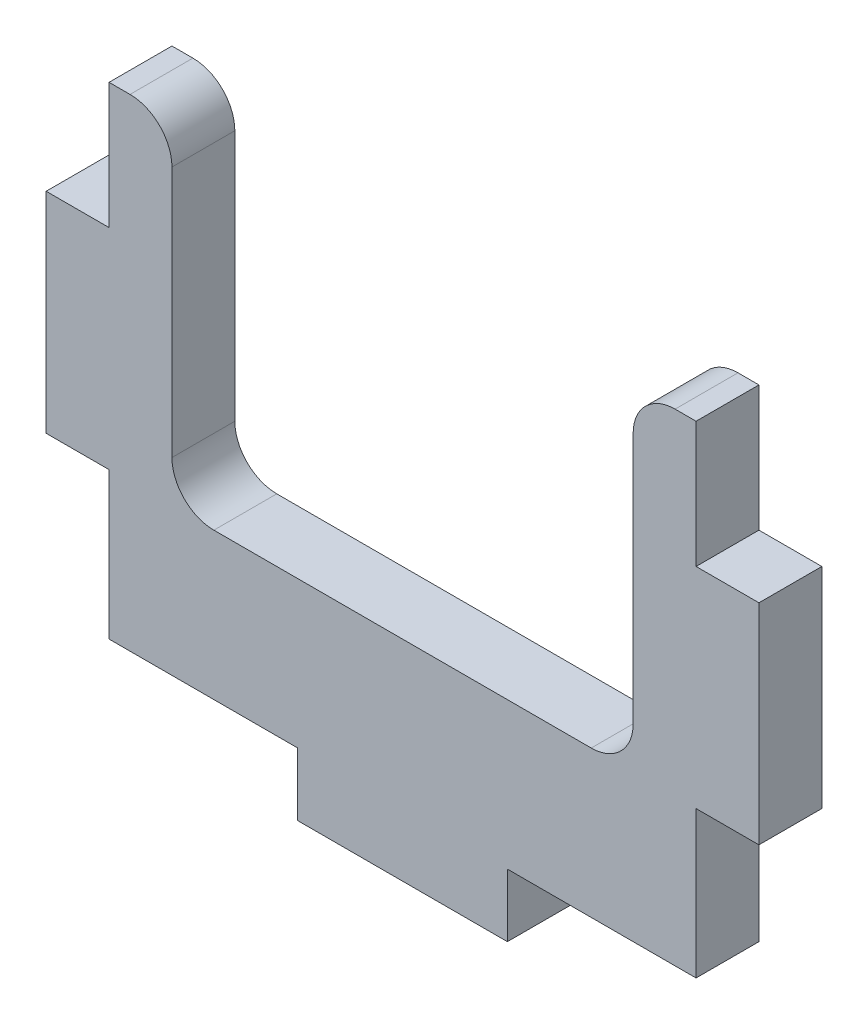
ISO-10303-21;
HEADER;
FILE_DESCRIPTION(('STEP AP214'),'2;1');
FILE_NAME('part.step','',(''),(''),'','','');
FILE_SCHEMA(('AUTOMOTIVE_DESIGN { 1 0 10303 214 1 1 1 1 }'));
ENDSEC;
DATA;
#1=APPLICATION_CONTEXT('core data for automotive mechanical design processes');
#2=APPLICATION_PROTOCOL_DEFINITION('international standard','automotive_design',2000,#1);
#3=PRODUCT_CONTEXT('',#1,'mechanical');
#4=PRODUCT('Part','Part','',(#3));
#5=PRODUCT_RELATED_PRODUCT_CATEGORY('part','',(#4));
#6=PRODUCT_DEFINITION_FORMATION('','',#4);
#7=PRODUCT_DEFINITION_CONTEXT('part definition',#1,'design');
#8=PRODUCT_DEFINITION('design','',#6,#7);
#9=PRODUCT_DEFINITION_SHAPE('','',#8);
#10=(LENGTH_UNIT() NAMED_UNIT(*) SI_UNIT(.MILLI.,.METRE.));
#11=(NAMED_UNIT(*) PLANE_ANGLE_UNIT() SI_UNIT($,.RADIAN.));
#12=(NAMED_UNIT(*) SI_UNIT($,.STERADIAN.) SOLID_ANGLE_UNIT());
#13=UNCERTAINTY_MEASURE_WITH_UNIT(LENGTH_MEASURE(1.E-05),#10,'distance_accuracy_value','');
#14=(GEOMETRIC_REPRESENTATION_CONTEXT(3) GLOBAL_UNCERTAINTY_ASSIGNED_CONTEXT((#13)) GLOBAL_UNIT_ASSIGNED_CONTEXT((#10,
#11,#12)) REPRESENTATION_CONTEXT('',''));
#15=CARTESIAN_POINT('',(0.,0.,0.));
#16=DIRECTION('',(0.,0.,1.));
#17=DIRECTION('',(1.,0.,0.));
#18=AXIS2_PLACEMENT_3D('',#15,#16,#17);
#19=CARTESIAN_POINT('',(-14.,11.,0.));
#20=DIRECTION('',(0.,-1.,0.));
#21=DIRECTION('',(0.,0.,-1.));
#22=AXIS2_PLACEMENT_3D('',#19,#20,#21);
#23=PLANE('',#22);
#24=DIRECTION('',(1.,0.,0.));
#25=VECTOR('',#24,1.);
#26=CARTESIAN_POINT('',(-14.,11.,3.));
#27=LINE('',#26,#25);
#28=CARTESIAN_POINT('',(-14.,11.,3.));
#29=VERTEX_POINT('',#28);
#30=CARTESIAN_POINT('',(-13.,11.,3.));
#31=VERTEX_POINT('',#30);
#32=EDGE_CURVE('E357',#29,#31,#27,.T.);
#33=ORIENTED_EDGE('',*,*,#32,.T.);
#34=DIRECTION('',(0.,0.,1.));
#35=VECTOR('',#34,1.);
#36=CARTESIAN_POINT('',(-13.,11.,0.));
#37=LINE('',#36,#35);
#38=CARTESIAN_POINT('',(-13.,11.,0.));
#39=VERTEX_POINT('',#38);
#40=EDGE_CURVE('E56',#31,#39,#37,.F.);
#41=ORIENTED_EDGE('',*,*,#40,.T.);
#42=DIRECTION('',(1.,0.,0.));
#43=VECTOR('',#42,1.);
#44=CARTESIAN_POINT('',(-14.,11.,0.));
#45=LINE('',#44,#43);
#46=CARTESIAN_POINT('',(-14.,11.,0.));
#47=VERTEX_POINT('',#46);
#48=EDGE_CURVE('E199',#47,#39,#45,.T.);
#49=ORIENTED_EDGE('',*,*,#48,.F.);
#50=DIRECTION('',(0.,0.,1.));
#51=VECTOR('',#50,1.);
#52=CARTESIAN_POINT('',(-14.,11.,0.));
#53=LINE('',#52,#51);
#54=EDGE_CURVE('E201',#47,#29,#53,.T.);
#55=ORIENTED_EDGE('',*,*,#54,.T.);
#56=EDGE_LOOP('',(#33,#41,#49,#55));
#57=FACE_BOUND('',#56,.T.);
#58=ADVANCED_FACE('F41',(#57),#23,.F.);
#59=CARTESIAN_POINT('',(14.,0.,3.));
#60=DIRECTION('',(1.,0.,0.));
#61=DIRECTION('',(0.,1.,0.));
#62=AXIS2_PLACEMENT_3D('',#59,#60,#61);
#63=PLANE('',#62);
#64=DIRECTION('',(0.,0.,1.));
#65=VECTOR('',#64,1.);
#66=CARTESIAN_POINT('',(14.,11.,0.));
#67=LINE('',#66,#65);
#68=CARTESIAN_POINT('',(14.,11.,0.));
#69=VERTEX_POINT('',#68);
#70=CARTESIAN_POINT('',(14.,11.,3.));
#71=VERTEX_POINT('',#70);
#72=EDGE_CURVE('E214',#69,#71,#67,.T.);
#73=ORIENTED_EDGE('',*,*,#72,.T.);
#74=DIRECTION('',(0.,-1.,0.));
#75=VECTOR('',#74,1.);
#76=CARTESIAN_POINT('',(14.,0.,3.));
#77=LINE('',#76,#75);
#78=CARTESIAN_POINT('',(14.,5.,3.));
#79=VERTEX_POINT('',#78);
#80=EDGE_CURVE('E258',#71,#79,#77,.T.);
#81=ORIENTED_EDGE('',*,*,#80,.T.);
#82=DIRECTION('',(0.,0.,-1.));
#83=VECTOR('',#82,1.);
#84=CARTESIAN_POINT('',(14.,5.,3.));
#85=LINE('',#84,#83);
#86=CARTESIAN_POINT('',(14.,5.,0.));
#87=VERTEX_POINT('',#86);
#88=EDGE_CURVE('E259',#79,#87,#85,.T.);
#89=ORIENTED_EDGE('',*,*,#88,.T.);
#90=DIRECTION('',(0.,-1.,0.));
#91=VECTOR('',#90,1.);
#92=CARTESIAN_POINT('',(14.,0.,0.));
#93=LINE('',#92,#91);
#94=EDGE_CURVE('E222',#69,#87,#93,.T.);
#95=ORIENTED_EDGE('',*,*,#94,.F.);
#96=EDGE_LOOP('',(#73,#81,#89,#95));
#97=FACE_BOUND('',#96,.T.);
#98=ADVANCED_FACE('F407',(#97),#63,.T.);
#99=CARTESIAN_POINT('',(-14.,0.,3.));
#100=DIRECTION('',(1.,0.,0.));
#101=DIRECTION('',(0.,1.,0.));
#102=AXIS2_PLACEMENT_3D('',#99,#100,#101);
#103=PLANE('',#102);
#104=DIRECTION('',(0.,-1.,0.));
#105=VECTOR('',#104,1.);
#106=CARTESIAN_POINT('',(-14.,0.,3.));
#107=LINE('',#106,#105);
#108=CARTESIAN_POINT('',(-14.,5.,3.));
#109=VERTEX_POINT('',#108);
#110=EDGE_CURVE('E213',#29,#109,#107,.T.);
#111=ORIENTED_EDGE('',*,*,#110,.F.);
#112=ORIENTED_EDGE('',*,*,#54,.F.);
#113=DIRECTION('',(0.,-1.,0.));
#114=VECTOR('',#113,1.);
#115=CARTESIAN_POINT('',(-14.,0.,0.));
#116=LINE('',#115,#114);
#117=CARTESIAN_POINT('',(-14.,5.,0.));
#118=VERTEX_POINT('',#117);
#119=EDGE_CURVE('E211',#47,#118,#116,.T.);
#120=ORIENTED_EDGE('',*,*,#119,.T.);
#121=DIRECTION('',(0.,0.,-1.));
#122=VECTOR('',#121,1.);
#123=CARTESIAN_POINT('',(-14.,5.,3.));
#124=LINE('',#123,#122);
#125=EDGE_CURVE('E290',#109,#118,#124,.T.);
#126=ORIENTED_EDGE('',*,*,#125,.F.);
#127=EDGE_LOOP('',(#111,#112,#120,#126));
#128=FACE_BOUND('',#127,.T.);
#129=ADVANCED_FACE('F209',(#128),#103,.F.);
#130=CARTESIAN_POINT('',(0.,4.99999999999999,3.));
#131=DIRECTION('',(0.,-1.,0.));
#132=DIRECTION('',(1.,0.,0.));
#133=AXIS2_PLACEMENT_3D('',#130,#131,#132);
#134=PLANE('',#133);
#135=DIRECTION('',(-1.,0.,0.));
#136=VECTOR('',#135,1.);
#137=CARTESIAN_POINT('',(0.,4.99999999999999,0.));
#138=LINE('',#137,#136);
#139=CARTESIAN_POINT('',(-17.,5.,0.));
#140=VERTEX_POINT('',#139);
#141=EDGE_CURVE('E221',#118,#140,#138,.T.);
#142=ORIENTED_EDGE('',*,*,#141,.T.);
#143=DIRECTION('',(0.,0.,-1.));
#144=VECTOR('',#143,1.);
#145=CARTESIAN_POINT('',(-17.,5.,3.));
#146=LINE('',#145,#144);
#147=CARTESIAN_POINT('',(-17.,5.,3.));
#148=VERTEX_POINT('',#147);
#149=EDGE_CURVE('E288',#148,#140,#146,.T.);
#150=ORIENTED_EDGE('',*,*,#149,.F.);
#151=DIRECTION('',(-1.,0.,0.));
#152=VECTOR('',#151,1.);
#153=CARTESIAN_POINT('',(0.,4.99999999999999,3.));
#154=LINE('',#153,#152);
#155=EDGE_CURVE('E364',#109,#148,#154,.T.);
#156=ORIENTED_EDGE('',*,*,#155,.F.);
#157=ORIENTED_EDGE('',*,*,#125,.T.);
#158=EDGE_LOOP('',(#142,#150,#156,#157));
#159=FACE_BOUND('',#158,.T.);
#160=ADVANCED_FACE('F479',(#159),#134,.F.);
#161=CARTESIAN_POINT('',(-17.,0.,3.));
#162=DIRECTION('',(-1.,0.,0.));
#163=DIRECTION('',(0.,0.,1.));
#164=AXIS2_PLACEMENT_3D('',#161,#162,#163);
#165=PLANE('',#164);
#166=DIRECTION('',(0.,1.,0.));
#167=VECTOR('',#166,1.);
#168=CARTESIAN_POINT('',(-17.,0.,0.));
#169=LINE('',#168,#167);
#170=CARTESIAN_POINT('',(-17.,-5.,0.));
#171=VERTEX_POINT('',#170);
#172=EDGE_CURVE('E225',#171,#140,#169,.T.);
#173=ORIENTED_EDGE('',*,*,#172,.F.);
#174=DIRECTION('',(0.,0.,-1.));
#175=VECTOR('',#174,1.);
#176=CARTESIAN_POINT('',(-17.,-5.,3.));
#177=LINE('',#176,#175);
#178=CARTESIAN_POINT('',(-17.,-5.,3.));
#179=VERTEX_POINT('',#178);
#180=EDGE_CURVE('E286',#179,#171,#177,.T.);
#181=ORIENTED_EDGE('',*,*,#180,.F.);
#182=DIRECTION('',(0.,1.,0.));
#183=VECTOR('',#182,1.);
#184=CARTESIAN_POINT('',(-17.,0.,3.));
#185=LINE('',#184,#183);
#186=EDGE_CURVE('E367',#179,#148,#185,.T.);
#187=ORIENTED_EDGE('',*,*,#186,.T.);
#188=ORIENTED_EDGE('',*,*,#149,.T.);
#189=EDGE_LOOP('',(#173,#181,#187,#188));
#190=FACE_BOUND('',#189,.T.);
#191=ADVANCED_FACE('F475',(#190),#165,.T.);
#192=CARTESIAN_POINT('',(0.,-4.99999999999999,3.));
#193=DIRECTION('',(0.,-1.,0.));
#194=DIRECTION('',(1.,0.,0.));
#195=AXIS2_PLACEMENT_3D('',#192,#193,#194);
#196=PLANE('',#195);
#197=DIRECTION('',(-1.,0.,0.));
#198=VECTOR('',#197,1.);
#199=CARTESIAN_POINT('',(0.,-4.99999999999999,0.));
#200=LINE('',#199,#198);
#201=CARTESIAN_POINT('',(-14.,-5.,0.));
#202=VERTEX_POINT('',#201);
#203=EDGE_CURVE('E230',#202,#171,#200,.T.);
#204=ORIENTED_EDGE('',*,*,#203,.F.);
#205=DIRECTION('',(0.,0.,-1.));
#206=VECTOR('',#205,1.);
#207=CARTESIAN_POINT('',(-14.,-5.,3.));
#208=LINE('',#207,#206);
#209=CARTESIAN_POINT('',(-14.,-5.,3.));
#210=VERTEX_POINT('',#209);
#211=EDGE_CURVE('E284',#210,#202,#208,.T.);
#212=ORIENTED_EDGE('',*,*,#211,.F.);
#213=DIRECTION('',(-1.,0.,0.));
#214=VECTOR('',#213,1.);
#215=CARTESIAN_POINT('',(0.,-4.99999999999999,3.));
#216=LINE('',#215,#214);
#217=EDGE_CURVE('E370',#210,#179,#216,.T.);
#218=ORIENTED_EDGE('',*,*,#217,.T.);
#219=ORIENTED_EDGE('',*,*,#180,.T.);
#220=EDGE_LOOP('',(#204,#212,#218,#219));
#221=FACE_BOUND('',#220,.T.);
#222=ADVANCED_FACE('F472',(#221),#196,.T.);
#223=CARTESIAN_POINT('',(-14.,-12.,0.));
#224=VERTEX_POINT('',#223);
#225=EDGE_CURVE('E224',#202,#224,#116,.T.);
#226=ORIENTED_EDGE('',*,*,#225,.T.);
#227=DIRECTION('',(0.,0.,-1.));
#228=VECTOR('',#227,1.);
#229=CARTESIAN_POINT('',(-14.,-12.,3.));
#230=LINE('',#229,#228);
#231=CARTESIAN_POINT('',(-14.,-12.,3.));
#232=VERTEX_POINT('',#231);
#233=EDGE_CURVE('E282',#232,#224,#230,.T.);
#234=ORIENTED_EDGE('',*,*,#233,.F.);
#235=EDGE_CURVE('E365',#210,#232,#107,.T.);
#236=ORIENTED_EDGE('',*,*,#235,.F.);
#237=ORIENTED_EDGE('',*,*,#211,.T.);
#238=EDGE_LOOP('',(#226,#234,#236,#237));
#239=FACE_BOUND('',#238,.T.);
#240=ADVANCED_FACE('F469',(#239),#103,.F.);
#241=CARTESIAN_POINT('',(0.,-12.,3.));
#242=DIRECTION('',(0.,1.,0.));
#243=DIRECTION('',(0.,0.,1.));
#244=AXIS2_PLACEMENT_3D('',#241,#242,#243);
#245=PLANE('',#244);
#246=DIRECTION('',(1.,0.,0.));
#247=VECTOR('',#246,1.);
#248=CARTESIAN_POINT('',(0.,-12.,0.));
#249=LINE('',#248,#247);
#250=CARTESIAN_POINT('',(-5.00000000000001,-12.,0.));
#251=VERTEX_POINT('',#250);
#252=EDGE_CURVE('E229',#224,#251,#249,.T.);
#253=ORIENTED_EDGE('',*,*,#252,.T.);
#254=DIRECTION('',(0.,0.,-1.));
#255=VECTOR('',#254,1.);
#256=CARTESIAN_POINT('',(-5.00000000000001,-12.,3.));
#257=LINE('',#256,#255);
#258=CARTESIAN_POINT('',(-5.00000000000001,-12.,3.));
#259=VERTEX_POINT('',#258);
#260=EDGE_CURVE('E279',#259,#251,#257,.T.);
#261=ORIENTED_EDGE('',*,*,#260,.F.);
#262=DIRECTION('',(1.,0.,0.));
#263=VECTOR('',#262,1.);
#264=CARTESIAN_POINT('',(0.,-12.,3.));
#265=LINE('',#264,#263);
#266=EDGE_CURVE('E373',#232,#259,#265,.T.);
#267=ORIENTED_EDGE('',*,*,#266,.F.);
#268=ORIENTED_EDGE('',*,*,#233,.T.);
#269=EDGE_LOOP('',(#253,#261,#267,#268));
#270=FACE_BOUND('',#269,.T.);
#271=ADVANCED_FACE('F457',(#270),#245,.F.);
#272=CARTESIAN_POINT('',(-5.00000000000002,0.,3.));
#273=DIRECTION('',(1.,0.,0.));
#274=DIRECTION('',(0.,1.,0.));
#275=AXIS2_PLACEMENT_3D('',#272,#273,#274);
#276=PLANE('',#275);
#277=DIRECTION('',(0.,-1.,0.));
#278=VECTOR('',#277,1.);
#279=CARTESIAN_POINT('',(-5.00000000000002,0.,0.));
#280=LINE('',#279,#278);
#281=CARTESIAN_POINT('',(-5.00000000000001,-15.,0.));
#282=VERTEX_POINT('',#281);
#283=EDGE_CURVE('E235',#251,#282,#280,.T.);
#284=ORIENTED_EDGE('',*,*,#283,.T.);
#285=DIRECTION('',(0.,0.,-1.));
#286=VECTOR('',#285,1.);
#287=CARTESIAN_POINT('',(-5.00000000000001,-15.,3.));
#288=LINE('',#287,#286);
#289=CARTESIAN_POINT('',(-5.00000000000001,-15.,3.));
#290=VERTEX_POINT('',#289);
#291=EDGE_CURVE('E276',#290,#282,#288,.T.);
#292=ORIENTED_EDGE('',*,*,#291,.F.);
#293=DIRECTION('',(0.,-1.,0.));
#294=VECTOR('',#293,1.);
#295=CARTESIAN_POINT('',(-5.00000000000002,0.,3.));
#296=LINE('',#295,#294);
#297=EDGE_CURVE('E375',#259,#290,#296,.T.);
#298=ORIENTED_EDGE('',*,*,#297,.F.);
#299=ORIENTED_EDGE('',*,*,#260,.T.);
#300=EDGE_LOOP('',(#284,#292,#298,#299));
#301=FACE_BOUND('',#300,.T.);
#302=ADVANCED_FACE('F464',(#301),#276,.F.);
#303=CARTESIAN_POINT('',(0.,-15.,3.));
#304=DIRECTION('',(0.,1.,0.));
#305=DIRECTION('',(0.,0.,1.));
#306=AXIS2_PLACEMENT_3D('',#303,#304,#305);
#307=PLANE('',#306);
#308=DIRECTION('',(1.,0.,0.));
#309=VECTOR('',#308,1.);
#310=CARTESIAN_POINT('',(0.,-15.,0.));
#311=LINE('',#310,#309);
#312=CARTESIAN_POINT('',(4.99999999999999,-15.,0.));
#313=VERTEX_POINT('',#312);
#314=EDGE_CURVE('E244',#282,#313,#311,.T.);
#315=ORIENTED_EDGE('',*,*,#314,.T.);
#316=DIRECTION('',(0.,0.,-1.));
#317=VECTOR('',#316,1.);
#318=CARTESIAN_POINT('',(4.99999999999999,-15.,3.));
#319=LINE('',#318,#317);
#320=CARTESIAN_POINT('',(4.99999999999999,-15.,3.));
#321=VERTEX_POINT('',#320);
#322=EDGE_CURVE('E274',#321,#313,#319,.T.);
#323=ORIENTED_EDGE('',*,*,#322,.F.);
#324=DIRECTION('',(1.,0.,0.));
#325=VECTOR('',#324,1.);
#326=CARTESIAN_POINT('',(0.,-15.,3.));
#327=LINE('',#326,#325);
#328=EDGE_CURVE('E378',#290,#321,#327,.T.);
#329=ORIENTED_EDGE('',*,*,#328,.F.);
#330=ORIENTED_EDGE('',*,*,#291,.T.);
#331=EDGE_LOOP('',(#315,#323,#329,#330));
#332=FACE_BOUND('',#331,.T.);
#333=ADVANCED_FACE('F460',(#332),#307,.F.);
#334=CARTESIAN_POINT('',(5.0000000000001,0.,3.));
#335=DIRECTION('',(1.,0.,0.));
#336=DIRECTION('',(0.,1.,0.));
#337=AXIS2_PLACEMENT_3D('',#334,#335,#336);
#338=PLANE('',#337);
#339=DIRECTION('',(0.,-1.,0.));
#340=VECTOR('',#339,1.);
#341=CARTESIAN_POINT('',(5.0000000000001,0.,0.));
#342=LINE('',#341,#340);
#343=CARTESIAN_POINT('',(5.00000000000001,-12.,0.));
#344=VERTEX_POINT('',#343);
#345=EDGE_CURVE('E247',#344,#313,#342,.T.);
#346=ORIENTED_EDGE('',*,*,#345,.F.);
#347=DIRECTION('',(0.,0.,-1.));
#348=VECTOR('',#347,1.);
#349=CARTESIAN_POINT('',(5.00000000000001,-12.,3.));
#350=LINE('',#349,#348);
#351=CARTESIAN_POINT('',(5.00000000000001,-12.,3.));
#352=VERTEX_POINT('',#351);
#353=EDGE_CURVE('E272',#352,#344,#350,.T.);
#354=ORIENTED_EDGE('',*,*,#353,.F.);
#355=DIRECTION('',(0.,-1.,0.));
#356=VECTOR('',#355,1.);
#357=CARTESIAN_POINT('',(5.0000000000001,0.,3.));
#358=LINE('',#357,#356);
#359=EDGE_CURVE('E380',#352,#321,#358,.T.);
#360=ORIENTED_EDGE('',*,*,#359,.T.);
#361=ORIENTED_EDGE('',*,*,#322,.T.);
#362=EDGE_LOOP('',(#346,#354,#360,#361));
#363=FACE_BOUND('',#362,.T.);
#364=ADVANCED_FACE('F455',(#363),#338,.T.);
#365=CARTESIAN_POINT('',(14.,-12.,0.));
#366=VERTEX_POINT('',#365);
#367=EDGE_CURVE('E237',#344,#366,#249,.T.);
#368=ORIENTED_EDGE('',*,*,#367,.T.);
#369=DIRECTION('',(0.,0.,-1.));
#370=VECTOR('',#369,1.);
#371=CARTESIAN_POINT('',(14.,-12.,3.));
#372=LINE('',#371,#370);
#373=CARTESIAN_POINT('',(14.,-12.,3.));
#374=VERTEX_POINT('',#373);
#375=EDGE_CURVE('E270',#374,#366,#372,.T.);
#376=ORIENTED_EDGE('',*,*,#375,.F.);
#377=EDGE_CURVE('E376',#352,#374,#265,.T.);
#378=ORIENTED_EDGE('',*,*,#377,.F.);
#379=ORIENTED_EDGE('',*,*,#353,.T.);
#380=EDGE_LOOP('',(#368,#376,#378,#379));
#381=FACE_BOUND('',#380,.T.);
#382=ADVANCED_FACE('F451',(#381),#245,.F.);
#383=CARTESIAN_POINT('',(14.,-5.,0.));
#384=VERTEX_POINT('',#383);
#385=EDGE_CURVE('E228',#384,#366,#93,.T.);
#386=ORIENTED_EDGE('',*,*,#385,.F.);
#387=DIRECTION('',(0.,0.,-1.));
#388=VECTOR('',#387,1.);
#389=CARTESIAN_POINT('',(14.,-5.,3.));
#390=LINE('',#389,#388);
#391=CARTESIAN_POINT('',(14.,-5.,3.));
#392=VERTEX_POINT('',#391);
#393=EDGE_CURVE('E268',#392,#384,#390,.T.);
#394=ORIENTED_EDGE('',*,*,#393,.F.);
#395=EDGE_CURVE('E362',#392,#374,#77,.T.);
#396=ORIENTED_EDGE('',*,*,#395,.T.);
#397=ORIENTED_EDGE('',*,*,#375,.T.);
#398=EDGE_LOOP('',(#386,#394,#396,#397));
#399=FACE_BOUND('',#398,.T.);
#400=ADVANCED_FACE('F427',(#399),#63,.T.);
#401=CARTESIAN_POINT('',(0.,-5.,3.));
#402=DIRECTION('',(0.,1.,0.));
#403=DIRECTION('',(0.,0.,1.));
#404=AXIS2_PLACEMENT_3D('',#401,#402,#403);
#405=PLANE('',#404);
#406=DIRECTION('',(1.,0.,0.));
#407=VECTOR('',#406,1.);
#408=CARTESIAN_POINT('',(0.,-5.,0.));
#409=LINE('',#408,#407);
#410=CARTESIAN_POINT('',(17.,-5.,0.));
#411=VERTEX_POINT('',#410);
#412=EDGE_CURVE('E250',#384,#411,#409,.T.);
#413=ORIENTED_EDGE('',*,*,#412,.T.);
#414=DIRECTION('',(0.,0.,-1.));
#415=VECTOR('',#414,1.);
#416=CARTESIAN_POINT('',(17.,-5.,3.));
#417=LINE('',#416,#415);
#418=CARTESIAN_POINT('',(17.,-5.,3.));
#419=VERTEX_POINT('',#418);
#420=EDGE_CURVE('E265',#419,#411,#417,.T.);
#421=ORIENTED_EDGE('',*,*,#420,.F.);
#422=DIRECTION('',(1.,0.,0.));
#423=VECTOR('',#422,1.);
#424=CARTESIAN_POINT('',(0.,-5.,3.));
#425=LINE('',#424,#423);
#426=EDGE_CURVE('E383',#392,#419,#425,.T.);
#427=ORIENTED_EDGE('',*,*,#426,.F.);
#428=ORIENTED_EDGE('',*,*,#393,.T.);
#429=EDGE_LOOP('',(#413,#421,#427,#428));
#430=FACE_BOUND('',#429,.T.);
#431=ADVANCED_FACE('F446',(#430),#405,.F.);
#432=CARTESIAN_POINT('',(17.,0.,3.));
#433=DIRECTION('',(-1.,0.,0.));
#434=DIRECTION('',(0.,-1.,0.));
#435=AXIS2_PLACEMENT_3D('',#432,#433,#434);
#436=PLANE('',#435);
#437=DIRECTION('',(0.,1.,0.));
#438=VECTOR('',#437,1.);
#439=CARTESIAN_POINT('',(17.,0.,0.));
#440=LINE('',#439,#438);
#441=CARTESIAN_POINT('',(17.,5.,0.));
#442=VERTEX_POINT('',#441);
#443=EDGE_CURVE('E252',#411,#442,#440,.T.);
#444=ORIENTED_EDGE('',*,*,#443,.T.);
#445=DIRECTION('',(0.,0.,-1.));
#446=VECTOR('',#445,1.);
#447=CARTESIAN_POINT('',(17.,5.,3.));
#448=LINE('',#447,#446);
#449=CARTESIAN_POINT('',(17.,5.,3.));
#450=VERTEX_POINT('',#449);
#451=EDGE_CURVE('E262',#450,#442,#448,.T.);
#452=ORIENTED_EDGE('',*,*,#451,.F.);
#453=DIRECTION('',(0.,1.,0.));
#454=VECTOR('',#453,1.);
#455=CARTESIAN_POINT('',(17.,0.,3.));
#456=LINE('',#455,#454);
#457=EDGE_CURVE('E385',#419,#450,#456,.T.);
#458=ORIENTED_EDGE('',*,*,#457,.F.);
#459=ORIENTED_EDGE('',*,*,#420,.T.);
#460=EDGE_LOOP('',(#444,#452,#458,#459));
#461=FACE_BOUND('',#460,.T.);
#462=ADVANCED_FACE('F400',(#461),#436,.F.);
#463=CARTESIAN_POINT('',(0.,4.99999999999999,3.));
#464=DIRECTION('',(0.,1.,0.));
#465=DIRECTION('',(-1.,0.,0.));
#466=AXIS2_PLACEMENT_3D('',#463,#464,#465);
#467=PLANE('',#466);
#468=DIRECTION('',(1.,0.,0.));
#469=VECTOR('',#468,1.);
#470=CARTESIAN_POINT('',(0.,4.99999999999999,0.));
#471=LINE('',#470,#469);
#472=EDGE_CURVE('E255',#87,#442,#471,.T.);
#473=ORIENTED_EDGE('',*,*,#472,.F.);
#474=ORIENTED_EDGE('',*,*,#88,.F.);
#475=DIRECTION('',(1.,0.,0.));
#476=VECTOR('',#475,1.);
#477=CARTESIAN_POINT('',(0.,4.99999999999999,3.));
#478=LINE('',#477,#476);
#479=EDGE_CURVE('E263',#79,#450,#478,.T.);
#480=ORIENTED_EDGE('',*,*,#479,.T.);
#481=ORIENTED_EDGE('',*,*,#451,.T.);
#482=EDGE_LOOP('',(#473,#474,#480,#481));
#483=FACE_BOUND('',#482,.T.);
#484=ADVANCED_FACE('F392',(#483),#467,.T.);
#485=CARTESIAN_POINT('',(0.,0.,3.));
#486=DIRECTION('',(0.,0.,1.));
#487=DIRECTION('',(1.,0.,0.));
#488=AXIS2_PLACEMENT_3D('',#485,#486,#487);
#489=PLANE('',#488);
#490=CARTESIAN_POINT('',(13.,11.,3.));
#491=VERTEX_POINT('',#490);
#492=EDGE_CURVE('E337',#491,#71,#27,.T.);
#493=ORIENTED_EDGE('',*,*,#492,.F.);
#494=CARTESIAN_POINT('',(13.,9.,3.));
#495=DIRECTION('',(0.,0.,1.));
#496=DIRECTION('',(1.,0.,0.));
#497=AXIS2_PLACEMENT_3D('',#494,#495,#496);
#498=CIRCLE('',#497,2.);
#499=CARTESIAN_POINT('',(11.,9.,3.));
#500=VERTEX_POINT('',#499);
#501=EDGE_CURVE('E311',#491,#500,#498,.T.);
#502=ORIENTED_EDGE('',*,*,#501,.T.);
#503=DIRECTION('',(0.,1.,0.));
#504=VECTOR('',#503,1.);
#505=CARTESIAN_POINT('',(11.,0.,3.));
#506=LINE('',#505,#504);
#507=CARTESIAN_POINT('',(11.,-3.,3.));
#508=VERTEX_POINT('',#507);
#509=EDGE_CURVE('E328',#508,#500,#506,.T.);
#510=ORIENTED_EDGE('',*,*,#509,.F.);
#511=CARTESIAN_POINT('',(9.,-3.,3.));
#512=DIRECTION('',(0.,0.,1.));
#513=DIRECTION('',(1.,0.,0.));
#514=AXIS2_PLACEMENT_3D('',#511,#512,#513);
#515=CIRCLE('',#514,2.);
#516=CARTESIAN_POINT('',(9.,-5.,3.));
#517=VERTEX_POINT('',#516);
#518=EDGE_CURVE('E49',#508,#517,#515,.F.);
#519=ORIENTED_EDGE('',*,*,#518,.T.);
#520=DIRECTION('',(1.,0.,0.));
#521=VECTOR('',#520,1.);
#522=CARTESIAN_POINT('',(0.,-5.,3.));
#523=LINE('',#522,#521);
#524=CARTESIAN_POINT('',(-9.,-5.,3.));
#525=VERTEX_POINT('',#524);
#526=EDGE_CURVE('E326',#525,#517,#523,.T.);
#527=ORIENTED_EDGE('',*,*,#526,.F.);
#528=CARTESIAN_POINT('',(-9.,-3.,3.));
#529=DIRECTION('',(0.,0.,1.));
#530=DIRECTION('',(1.,0.,0.));
#531=AXIS2_PLACEMENT_3D('',#528,#529,#530);
#532=CIRCLE('',#531,2.);
#533=CARTESIAN_POINT('',(-11.,-3.,3.));
#534=VERTEX_POINT('',#533);
#535=EDGE_CURVE('E318',#525,#534,#532,.F.);
#536=ORIENTED_EDGE('',*,*,#535,.T.);
#537=DIRECTION('',(0.,-1.,0.));
#538=VECTOR('',#537,1.);
#539=CARTESIAN_POINT('',(-11.,0.,3.));
#540=LINE('',#539,#538);
#541=CARTESIAN_POINT('',(-11.,9.,3.));
#542=VERTEX_POINT('',#541);
#543=EDGE_CURVE('E338',#542,#534,#540,.T.);
#544=ORIENTED_EDGE('',*,*,#543,.F.);
#545=CARTESIAN_POINT('',(-13.,9.,3.));
#546=DIRECTION('',(0.,0.,1.));
#547=DIRECTION('',(1.,0.,0.));
#548=AXIS2_PLACEMENT_3D('',#545,#546,#547);
#549=CIRCLE('',#548,2.);
#550=EDGE_CURVE('E64',#542,#31,#549,.T.);
#551=ORIENTED_EDGE('',*,*,#550,.T.);
#552=ORIENTED_EDGE('',*,*,#32,.F.);
#553=ORIENTED_EDGE('',*,*,#110,.T.);
#554=ORIENTED_EDGE('',*,*,#155,.T.);
#555=ORIENTED_EDGE('',*,*,#186,.F.);
#556=ORIENTED_EDGE('',*,*,#217,.F.);
#557=ORIENTED_EDGE('',*,*,#235,.T.);
#558=ORIENTED_EDGE('',*,*,#266,.T.);
#559=ORIENTED_EDGE('',*,*,#297,.T.);
#560=ORIENTED_EDGE('',*,*,#328,.T.);
#561=ORIENTED_EDGE('',*,*,#359,.F.);
#562=ORIENTED_EDGE('',*,*,#377,.T.);
#563=ORIENTED_EDGE('',*,*,#395,.F.);
#564=ORIENTED_EDGE('',*,*,#426,.T.);
#565=ORIENTED_EDGE('',*,*,#457,.T.);
#566=ORIENTED_EDGE('',*,*,#479,.F.);
#567=ORIENTED_EDGE('',*,*,#80,.F.);
#568=EDGE_LOOP('',(#493,#502,#510,#519,#527,#536,#544,#551,#552,#553,#554,#555,#556,#557,#558,
#559,#560,#561,#562,#563,#564,#565,#566,#567));
#569=FACE_BOUND('',#568,.T.);
#570=ADVANCED_FACE('F325',(#569),#489,.T.);
#571=CARTESIAN_POINT('',(0.,0.,0.));
#572=DIRECTION('',(0.,0.,1.));
#573=DIRECTION('',(1.,0.,0.));
#574=AXIS2_PLACEMENT_3D('',#571,#572,#573);
#575=PLANE('',#574);
#576=DIRECTION('',(0.,1.,0.));
#577=VECTOR('',#576,1.);
#578=CARTESIAN_POINT('',(11.,11.,0.));
#579=LINE('',#578,#577);
#580=CARTESIAN_POINT('',(11.,-3.,0.));
#581=VERTEX_POINT('',#580);
#582=CARTESIAN_POINT('',(11.,9.,0.));
#583=VERTEX_POINT('',#582);
#584=EDGE_CURVE('E343',#581,#583,#579,.T.);
#585=ORIENTED_EDGE('',*,*,#584,.T.);
#586=CARTESIAN_POINT('',(13.,9.,0.));
#587=DIRECTION('',(0.,0.,1.));
#588=DIRECTION('',(1.,0.,0.));
#589=AXIS2_PLACEMENT_3D('',#586,#587,#588);
#590=CIRCLE('',#589,2.);
#591=CARTESIAN_POINT('',(13.,11.,0.));
#592=VERTEX_POINT('',#591);
#593=EDGE_CURVE('E315',#583,#592,#590,.F.);
#594=ORIENTED_EDGE('',*,*,#593,.T.);
#595=EDGE_CURVE('E205',#592,#69,#45,.T.);
#596=ORIENTED_EDGE('',*,*,#595,.T.);
#597=ORIENTED_EDGE('',*,*,#94,.T.);
#598=ORIENTED_EDGE('',*,*,#472,.T.);
#599=ORIENTED_EDGE('',*,*,#443,.F.);
#600=ORIENTED_EDGE('',*,*,#412,.F.);
#601=ORIENTED_EDGE('',*,*,#385,.T.);
#602=ORIENTED_EDGE('',*,*,#367,.F.);
#603=ORIENTED_EDGE('',*,*,#345,.T.);
#604=ORIENTED_EDGE('',*,*,#314,.F.);
#605=ORIENTED_EDGE('',*,*,#283,.F.);
#606=ORIENTED_EDGE('',*,*,#252,.F.);
#607=ORIENTED_EDGE('',*,*,#225,.F.);
#608=ORIENTED_EDGE('',*,*,#203,.T.);
#609=ORIENTED_EDGE('',*,*,#172,.T.);
#610=ORIENTED_EDGE('',*,*,#141,.F.);
#611=ORIENTED_EDGE('',*,*,#119,.F.);
#612=ORIENTED_EDGE('',*,*,#48,.T.);
#613=CARTESIAN_POINT('',(-13.,9.,0.));
#614=DIRECTION('',(0.,0.,1.));
#615=DIRECTION('',(1.,0.,0.));
#616=AXIS2_PLACEMENT_3D('',#613,#614,#615);
#617=CIRCLE('',#616,2.);
#618=CARTESIAN_POINT('',(-11.,9.,0.));
#619=VERTEX_POINT('',#618);
#620=EDGE_CURVE('E313',#39,#619,#617,.F.);
#621=ORIENTED_EDGE('',*,*,#620,.T.);
#622=DIRECTION('',(0.,-1.,0.));
#623=VECTOR('',#622,1.);
#624=CARTESIAN_POINT('',(-11.,11.,0.));
#625=LINE('',#624,#623);
#626=CARTESIAN_POINT('',(-11.,-3.,0.));
#627=VERTEX_POINT('',#626);
#628=EDGE_CURVE('E351',#619,#627,#625,.T.);
#629=ORIENTED_EDGE('',*,*,#628,.T.);
#630=CARTESIAN_POINT('',(-9.,-3.,0.));
#631=DIRECTION('',(0.,0.,1.));
#632=DIRECTION('',(1.,0.,0.));
#633=AXIS2_PLACEMENT_3D('',#630,#631,#632);
#634=CIRCLE('',#633,2.);
#635=CARTESIAN_POINT('',(-9.,-5.,0.));
#636=VERTEX_POINT('',#635);
#637=EDGE_CURVE('E320',#627,#636,#634,.T.);
#638=ORIENTED_EDGE('',*,*,#637,.T.);
#639=DIRECTION('',(1.,0.,0.));
#640=VECTOR('',#639,1.);
#641=CARTESIAN_POINT('',(-11.,-5.,0.));
#642=LINE('',#641,#640);
#643=CARTESIAN_POINT('',(9.,-5.,0.));
#644=VERTEX_POINT('',#643);
#645=EDGE_CURVE('E345',#636,#644,#642,.T.);
#646=ORIENTED_EDGE('',*,*,#645,.T.);
#647=CARTESIAN_POINT('',(9.,-3.,0.));
#648=DIRECTION('',(0.,0.,1.));
#649=DIRECTION('',(1.,0.,0.));
#650=AXIS2_PLACEMENT_3D('',#647,#648,#649);
#651=CIRCLE('',#650,2.);
#652=EDGE_CURVE('E11',#644,#581,#651,.T.);
#653=ORIENTED_EDGE('',*,*,#652,.T.);
#654=EDGE_LOOP('',(#585,#594,#596,#597,#598,#599,#600,#601,#602,#603,#604,#605,#606,#607,#608,
#609,#610,#611,#612,#621,#629,#638,#646,#653));
#655=FACE_BOUND('',#654,.T.);
#656=ADVANCED_FACE('F218',(#655),#575,.F.);
#657=ORIENTED_EDGE('',*,*,#595,.F.);
#658=DIRECTION('',(0.,0.,1.));
#659=VECTOR('',#658,1.);
#660=CARTESIAN_POINT('',(13.,11.,0.));
#661=LINE('',#660,#659);
#662=EDGE_CURVE('E307',#592,#491,#661,.T.);
#663=ORIENTED_EDGE('',*,*,#662,.T.);
#664=ORIENTED_EDGE('',*,*,#492,.T.);
#665=ORIENTED_EDGE('',*,*,#72,.F.);
#666=EDGE_LOOP('',(#657,#663,#664,#665));
#667=FACE_BOUND('',#666,.T.);
#668=ADVANCED_FACE('F409',(#667),#23,.F.);
#669=CARTESIAN_POINT('',(-11.,11.,0.));
#670=DIRECTION('',(-1.,0.,0.));
#671=DIRECTION('',(0.,-1.,0.));
#672=AXIS2_PLACEMENT_3D('',#669,#670,#671);
#673=PLANE('',#672);
#674=ORIENTED_EDGE('',*,*,#543,.T.);
#675=DIRECTION('',(0.,0.,1.));
#676=VECTOR('',#675,1.);
#677=CARTESIAN_POINT('',(-11.,-3.,0.));
#678=LINE('',#677,#676);
#679=EDGE_CURVE('E300',#534,#627,#678,.F.);
#680=ORIENTED_EDGE('',*,*,#679,.T.);
#681=ORIENTED_EDGE('',*,*,#628,.F.);
#682=DIRECTION('',(0.,0.,1.));
#683=VECTOR('',#682,1.);
#684=CARTESIAN_POINT('',(-11.,9.,0.));
#685=LINE('',#684,#683);
#686=EDGE_CURVE('E297',#619,#542,#685,.T.);
#687=ORIENTED_EDGE('',*,*,#686,.T.);
#688=EDGE_LOOP('',(#674,#680,#681,#687));
#689=FACE_BOUND('',#688,.T.);
#690=ADVANCED_FACE('F431',(#689),#673,.F.);
#691=CARTESIAN_POINT('',(11.,11.,0.));
#692=DIRECTION('',(1.,0.,0.));
#693=DIRECTION('',(0.,1.,0.));
#694=AXIS2_PLACEMENT_3D('',#691,#692,#693);
#695=PLANE('',#694);
#696=ORIENTED_EDGE('',*,*,#584,.F.);
#697=DIRECTION('',(0.,0.,1.));
#698=VECTOR('',#697,1.);
#699=CARTESIAN_POINT('',(11.,-3.,3.));
#700=LINE('',#699,#698);
#701=EDGE_CURVE('E304',#581,#508,#700,.T.);
#702=ORIENTED_EDGE('',*,*,#701,.T.);
#703=ORIENTED_EDGE('',*,*,#509,.T.);
#704=DIRECTION('',(0.,0.,1.));
#705=VECTOR('',#704,1.);
#706=CARTESIAN_POINT('',(11.,9.,0.));
#707=LINE('',#706,#705);
#708=EDGE_CURVE('E302',#500,#583,#707,.F.);
#709=ORIENTED_EDGE('',*,*,#708,.T.);
#710=EDGE_LOOP('',(#696,#702,#703,#709));
#711=FACE_BOUND('',#710,.T.);
#712=ADVANCED_FACE('F347',(#711),#695,.F.);
#713=CARTESIAN_POINT('',(-11.,-5.,0.));
#714=DIRECTION('',(0.,-1.,0.));
#715=DIRECTION('',(0.,0.,-1.));
#716=AXIS2_PLACEMENT_3D('',#713,#714,#715);
#717=PLANE('',#716);
#718=ORIENTED_EDGE('',*,*,#645,.F.);
#719=DIRECTION('',(0.,0.,1.));
#720=VECTOR('',#719,1.);
#721=CARTESIAN_POINT('',(-9.,-5.,3.));
#722=LINE('',#721,#720);
#723=EDGE_CURVE('E294',#636,#525,#722,.T.);
#724=ORIENTED_EDGE('',*,*,#723,.T.);
#725=ORIENTED_EDGE('',*,*,#526,.T.);
#726=DIRECTION('',(0.,0.,1.));
#727=VECTOR('',#726,1.);
#728=CARTESIAN_POINT('',(9.,-5.,0.));
#729=LINE('',#728,#727);
#730=EDGE_CURVE('E292',#517,#644,#729,.F.);
#731=ORIENTED_EDGE('',*,*,#730,.T.);
#732=EDGE_LOOP('',(#718,#724,#725,#731));
#733=FACE_BOUND('',#732,.T.);
#734=ADVANCED_FACE('F334',(#733),#717,.F.);
#735=CARTESIAN_POINT('',(-9.,-3.,0.));
#736=DIRECTION('',(0.,0.,-1.));
#737=DIRECTION('',(-1.,0.,0.));
#738=AXIS2_PLACEMENT_3D('',#735,#736,#737);
#739=CYLINDRICAL_SURFACE('',#738,2.);
#740=ORIENTED_EDGE('',*,*,#637,.F.);
#741=ORIENTED_EDGE('',*,*,#679,.F.);
#742=ORIENTED_EDGE('',*,*,#535,.F.);
#743=ORIENTED_EDGE('',*,*,#723,.F.);
#744=EDGE_LOOP('',(#740,#741,#742,#743));
#745=FACE_BOUND('',#744,.T.);
#746=ADVANCED_FACE('F419',(#745),#739,.F.);
#747=CARTESIAN_POINT('',(9.,-3.,0.));
#748=DIRECTION('',(0.,0.,-1.));
#749=DIRECTION('',(-1.,0.,0.));
#750=AXIS2_PLACEMENT_3D('',#747,#748,#749);
#751=CYLINDRICAL_SURFACE('',#750,2.);
#752=ORIENTED_EDGE('',*,*,#652,.F.);
#753=ORIENTED_EDGE('',*,*,#730,.F.);
#754=ORIENTED_EDGE('',*,*,#518,.F.);
#755=ORIENTED_EDGE('',*,*,#701,.F.);
#756=EDGE_LOOP('',(#752,#753,#754,#755));
#757=FACE_BOUND('',#756,.T.);
#758=ADVANCED_FACE('F341',(#757),#751,.F.);
#759=CARTESIAN_POINT('',(13.,9.,0.));
#760=DIRECTION('',(0.,0.,1.));
#761=DIRECTION('',(1.,0.,0.));
#762=AXIS2_PLACEMENT_3D('',#759,#760,#761);
#763=CYLINDRICAL_SURFACE('',#762,2.);
#764=ORIENTED_EDGE('',*,*,#593,.F.);
#765=ORIENTED_EDGE('',*,*,#708,.F.);
#766=ORIENTED_EDGE('',*,*,#501,.F.);
#767=ORIENTED_EDGE('',*,*,#662,.F.);
#768=EDGE_LOOP('',(#764,#765,#766,#767));
#769=FACE_BOUND('',#768,.T.);
#770=ADVANCED_FACE('F412',(#769),#763,.T.);
#771=CARTESIAN_POINT('',(-13.,9.,0.));
#772=DIRECTION('',(0.,0.,1.));
#773=DIRECTION('',(1.,0.,0.));
#774=AXIS2_PLACEMENT_3D('',#771,#772,#773);
#775=CYLINDRICAL_SURFACE('',#774,2.);
#776=ORIENTED_EDGE('',*,*,#620,.F.);
#777=ORIENTED_EDGE('',*,*,#40,.F.);
#778=ORIENTED_EDGE('',*,*,#550,.F.);
#779=ORIENTED_EDGE('',*,*,#686,.F.);
#780=EDGE_LOOP('',(#776,#777,#778,#779));
#781=FACE_BOUND('',#780,.T.);
#782=ADVANCED_FACE('F43',(#781),#775,.T.);
#783=CLOSED_SHELL('',(#58,#98,#129,#160,#191,#222,#240,#271,#302,#333,#364,#382,#400,#431,#462,
#484,#570,#656,#668,#690,#712,#734,#746,#758,#770,#782));
#784=MANIFOLD_SOLID_BREP('B2',#783);
#785=ADVANCED_BREP_SHAPE_REPRESENTATION('',(#18,#784),#14);
#786=SHAPE_DEFINITION_REPRESENTATION(#9,#785);
ENDSEC;
END-ISO-10303-21;
